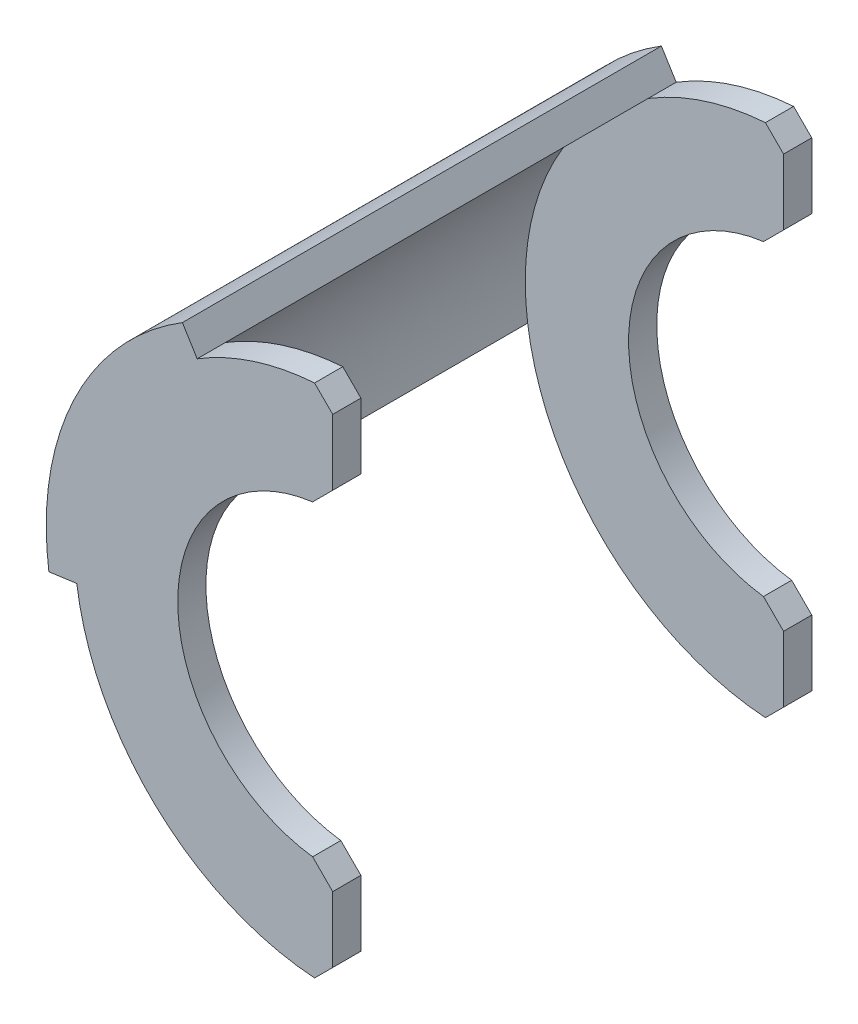
ISO-10303-21;
HEADER;
FILE_DESCRIPTION(('STEP AP214'),'2;1');
FILE_NAME('part.step','',(''),(''),'','','');
FILE_SCHEMA(('AUTOMOTIVE_DESIGN { 1 0 10303 214 1 1 1 1 }'));
ENDSEC;
DATA;
#1=APPLICATION_CONTEXT('core data for automotive mechanical design processes');
#2=APPLICATION_PROTOCOL_DEFINITION('international standard','automotive_design',2000,#1);
#3=PRODUCT_CONTEXT('',#1,'mechanical');
#4=PRODUCT('Part','Part','',(#3));
#5=PRODUCT_RELATED_PRODUCT_CATEGORY('part','',(#4));
#6=PRODUCT_DEFINITION_FORMATION('','',#4);
#7=PRODUCT_DEFINITION_CONTEXT('part definition',#1,'design');
#8=PRODUCT_DEFINITION('design','',#6,#7);
#9=PRODUCT_DEFINITION_SHAPE('','',#8);
#10=(LENGTH_UNIT() NAMED_UNIT(*) SI_UNIT(.MILLI.,.METRE.));
#11=(NAMED_UNIT(*) PLANE_ANGLE_UNIT() SI_UNIT($,.RADIAN.));
#12=(NAMED_UNIT(*) SI_UNIT($,.STERADIAN.) SOLID_ANGLE_UNIT());
#13=UNCERTAINTY_MEASURE_WITH_UNIT(LENGTH_MEASURE(1.E-05),#10,'distance_accuracy_value','');
#14=(GEOMETRIC_REPRESENTATION_CONTEXT(3) GLOBAL_UNCERTAINTY_ASSIGNED_CONTEXT((#13)) GLOBAL_UNIT_ASSIGNED_CONTEXT((#10,
#11,#12)) REPRESENTATION_CONTEXT('',''));
#15=CARTESIAN_POINT('',(0.,0.,0.));
#16=DIRECTION('',(0.,0.,1.));
#17=DIRECTION('',(1.,0.,0.));
#18=AXIS2_PLACEMENT_3D('',#15,#16,#17);
#19=CARTESIAN_POINT('',(0.,0.,-48.));
#20=DIRECTION('',(0.,0.,-1.));
#21=DIRECTION('',(-1.,0.,0.));
#22=AXIS2_PLACEMENT_3D('',#19,#20,#21);
#23=CYLINDRICAL_SURFACE('',#22,27.5);
#24=CARTESIAN_POINT('',(0.,0.,-51.));
#25=DIRECTION('',(0.,0.,-1.));
#26=DIRECTION('',(-1.,0.,0.));
#27=AXIS2_PLACEMENT_3D('',#24,#25,#26);
#28=CIRCLE('',#27,27.5);
#29=CARTESIAN_POINT('',(-1.93204686002601,-27.432046860026,-51.));
#30=VERTEX_POINT('',#29);
#31=CARTESIAN_POINT('',(-1.93204686002601,27.432046860026,-51.));
#32=VERTEX_POINT('',#31);
#33=EDGE_CURVE('E176',#30,#32,#28,.T.);
#34=ORIENTED_EDGE('',*,*,#33,.F.);
#35=DIRECTION('',(0.,0.,-1.));
#36=VECTOR('',#35,1.);
#37=CARTESIAN_POINT('',(-1.93204686002601,-27.432046860026,-48.));
#38=LINE('',#37,#36);
#39=CARTESIAN_POINT('',(-1.93204686002601,-27.432046860026,-48.));
#40=VERTEX_POINT('',#39);
#41=EDGE_CURVE('E156',#30,#40,#38,.F.);
#42=ORIENTED_EDGE('',*,*,#41,.T.);
#43=CARTESIAN_POINT('',(0.,0.,-48.));
#44=DIRECTION('',(0.,0.,-1.));
#45=DIRECTION('',(-1.,0.,0.));
#46=AXIS2_PLACEMENT_3D('',#43,#44,#45);
#47=CIRCLE('',#46,27.5);
#48=CARTESIAN_POINT('',(-1.93204686002601,27.432046860026,-48.));
#49=VERTEX_POINT('',#48);
#50=EDGE_CURVE('E137',#40,#49,#47,.T.);
#51=ORIENTED_EDGE('',*,*,#50,.T.);
#52=DIRECTION('',(0.,0.,-1.));
#53=VECTOR('',#52,1.);
#54=CARTESIAN_POINT('',(-1.93204686002601,27.432046860026,-48.));
#55=LINE('',#54,#53);
#56=EDGE_CURVE('E153',#49,#32,#55,.T.);
#57=ORIENTED_EDGE('',*,*,#56,.T.);
#58=EDGE_LOOP('',(#34,#42,#51,#57));
#59=FACE_BOUND('',#58,.T.);
#60=ADVANCED_FACE('F50',(#59),#23,.T.);
#61=CARTESIAN_POINT('',(0.,-16.5,-48.));
#62=DIRECTION('',(1.,0.,0.));
#63=DIRECTION('',(0.,1.,0.));
#64=AXIS2_PLACEMENT_3D('',#61,#62,#63);
#65=PLANE('',#64);
#66=DIRECTION('',(0.,-1.,0.));
#67=VECTOR('',#66,1.);
#68=CARTESIAN_POINT('',(0.,-16.5,-48.));
#69=LINE('',#68,#67);
#70=CARTESIAN_POINT('',(0.,-18.5,-48.));
#71=VERTEX_POINT('',#70);
#72=CARTESIAN_POINT('',(0.,-25.5,-48.));
#73=VERTEX_POINT('',#72);
#74=EDGE_CURVE('E142',#71,#73,#69,.T.);
#75=ORIENTED_EDGE('',*,*,#74,.T.);
#76=DIRECTION('',(0.,0.,-1.));
#77=VECTOR('',#76,1.);
#78=CARTESIAN_POINT('',(0.,-25.5,-48.));
#79=LINE('',#78,#77);
#80=CARTESIAN_POINT('',(0.,-25.5,-51.));
#81=VERTEX_POINT('',#80);
#82=EDGE_CURVE('E136',#73,#81,#79,.T.);
#83=ORIENTED_EDGE('',*,*,#82,.T.);
#84=DIRECTION('',(0.,-1.,0.));
#85=VECTOR('',#84,1.);
#86=CARTESIAN_POINT('',(0.,-16.5,-51.));
#87=LINE('',#86,#85);
#88=CARTESIAN_POINT('',(0.,-18.5,-51.));
#89=VERTEX_POINT('',#88);
#90=EDGE_CURVE('E119',#89,#81,#87,.T.);
#91=ORIENTED_EDGE('',*,*,#90,.F.);
#92=DIRECTION('',(0.,0.,1.));
#93=VECTOR('',#92,1.);
#94=CARTESIAN_POINT('',(0.,-18.5,-48.));
#95=LINE('',#94,#93);
#96=EDGE_CURVE('E133',#89,#71,#95,.T.);
#97=ORIENTED_EDGE('',*,*,#96,.T.);
#98=EDGE_LOOP('',(#75,#83,#91,#97));
#99=FACE_BOUND('',#98,.T.);
#100=ADVANCED_FACE('F132',(#99),#65,.T.);
#101=CARTESIAN_POINT('',(0.,0.,-48.));
#102=DIRECTION('',(0.,0.,-1.));
#103=DIRECTION('',(-1.,0.,0.));
#104=AXIS2_PLACEMENT_3D('',#101,#102,#103);
#105=CYLINDRICAL_SURFACE('',#104,16.5);
#106=CARTESIAN_POINT('',(0.,0.,-48.));
#107=DIRECTION('',(0.,0.,1.));
#108=DIRECTION('',(-1.,0.,0.));
#109=AXIS2_PLACEMENT_3D('',#106,#107,#108);
#110=CIRCLE('',#109,16.5);
#111=CARTESIAN_POINT('',(-2.13926867333605,16.3607313266639,-48.));
#112=VERTEX_POINT('',#111);
#113=CARTESIAN_POINT('',(-2.13926867333606,-16.3607313266639,-48.));
#114=VERTEX_POINT('',#113);
#115=EDGE_CURVE('E146',#112,#114,#110,.T.);
#116=ORIENTED_EDGE('',*,*,#115,.T.);
#117=DIRECTION('',(0.,0.,-1.));
#118=VECTOR('',#117,1.);
#119=CARTESIAN_POINT('',(-2.13926867333606,-16.3607313266639,-48.));
#120=LINE('',#119,#118);
#121=CARTESIAN_POINT('',(-2.13926867333606,-16.3607313266639,-51.));
#122=VERTEX_POINT('',#121);
#123=EDGE_CURVE('E166',#114,#122,#120,.T.);
#124=ORIENTED_EDGE('',*,*,#123,.T.);
#125=CARTESIAN_POINT('',(0.,0.,-51.));
#126=DIRECTION('',(0.,0.,1.));
#127=DIRECTION('',(-1.,0.,0.));
#128=AXIS2_PLACEMENT_3D('',#125,#126,#127);
#129=CIRCLE('',#128,16.5);
#130=CARTESIAN_POINT('',(-2.13926867333605,16.3607313266639,-51.));
#131=VERTEX_POINT('',#130);
#132=EDGE_CURVE('E121',#131,#122,#129,.T.);
#133=ORIENTED_EDGE('',*,*,#132,.F.);
#134=DIRECTION('',(0.,0.,-1.));
#135=VECTOR('',#134,1.);
#136=CARTESIAN_POINT('',(-2.13926867333605,16.3607313266639,-48.));
#137=LINE('',#136,#135);
#138=EDGE_CURVE('E164',#131,#112,#137,.F.);
#139=ORIENTED_EDGE('',*,*,#138,.T.);
#140=EDGE_LOOP('',(#116,#124,#133,#139));
#141=FACE_BOUND('',#140,.T.);
#142=ADVANCED_FACE('F169',(#141),#105,.F.);
#143=CARTESIAN_POINT('',(0.,27.5,-48.));
#144=DIRECTION('',(1.,0.,0.));
#145=DIRECTION('',(0.,1.,0.));
#146=AXIS2_PLACEMENT_3D('',#143,#144,#145);
#147=PLANE('',#146);
#148=DIRECTION('',(0.,-1.,0.));
#149=VECTOR('',#148,1.);
#150=CARTESIAN_POINT('',(0.,27.5,-48.));
#151=LINE('',#150,#149);
#152=CARTESIAN_POINT('',(0.,25.5,-48.));
#153=VERTEX_POINT('',#152);
#154=CARTESIAN_POINT('',(0.,18.5,-48.));
#155=VERTEX_POINT('',#154);
#156=EDGE_CURVE('E171',#153,#155,#151,.T.);
#157=ORIENTED_EDGE('',*,*,#156,.T.);
#158=DIRECTION('',(0.,0.,-1.));
#159=VECTOR('',#158,1.);
#160=CARTESIAN_POINT('',(0.,18.5,-48.));
#161=LINE('',#160,#159);
#162=CARTESIAN_POINT('',(0.,18.5,-51.));
#163=VERTEX_POINT('',#162);
#164=EDGE_CURVE('E12',#155,#163,#161,.T.);
#165=ORIENTED_EDGE('',*,*,#164,.T.);
#166=DIRECTION('',(0.,-1.,0.));
#167=VECTOR('',#166,1.);
#168=CARTESIAN_POINT('',(0.,27.5,-51.));
#169=LINE('',#168,#167);
#170=CARTESIAN_POINT('',(0.,25.5,-51.));
#171=VERTEX_POINT('',#170);
#172=EDGE_CURVE('E179',#171,#163,#169,.T.);
#173=ORIENTED_EDGE('',*,*,#172,.F.);
#174=DIRECTION('',(0.,0.,1.));
#175=VECTOR('',#174,1.);
#176=CARTESIAN_POINT('',(0.,25.5,-48.));
#177=LINE('',#176,#175);
#178=EDGE_CURVE('E58',#171,#153,#177,.T.);
#179=ORIENTED_EDGE('',*,*,#178,.T.);
#180=EDGE_LOOP('',(#157,#165,#173,#179));
#181=FACE_BOUND('',#180,.T.);
#182=ADVANCED_FACE('F181',(#181),#147,.T.);
#183=CARTESIAN_POINT('',(0.,0.,-48.));
#184=DIRECTION('',(0.,0.,-1.));
#185=DIRECTION('',(-1.,0.,0.));
#186=AXIS2_PLACEMENT_3D('',#183,#184,#185);
#187=PLANE('',#186);
#188=ORIENTED_EDGE('',*,*,#50,.F.);
#189=DIRECTION('',(-0.707106781186548,-0.707106781186547,0.));
#190=VECTOR('',#189,1.);
#191=CARTESIAN_POINT('',(0.,-25.5,-48.));
#192=LINE('',#191,#190);
#193=EDGE_CURVE('E162',#40,#73,#192,.F.);
#194=ORIENTED_EDGE('',*,*,#193,.T.);
#195=ORIENTED_EDGE('',*,*,#74,.F.);
#196=DIRECTION('',(0.707106781186548,-0.707106781186547,0.));
#197=VECTOR('',#196,1.);
#198=CARTESIAN_POINT('',(-2.13926867333606,-16.3607313266639,-48.));
#199=LINE('',#198,#197);
#200=EDGE_CURVE('E141',#71,#114,#199,.F.);
#201=ORIENTED_EDGE('',*,*,#200,.T.);
#202=ORIENTED_EDGE('',*,*,#115,.F.);
#203=DIRECTION('',(-0.707106781186548,-0.707106781186547,0.));
#204=VECTOR('',#203,1.);
#205=CARTESIAN_POINT('',(0.,18.5,-48.));
#206=LINE('',#205,#204);
#207=EDGE_CURVE('E65',#112,#155,#206,.F.);
#208=ORIENTED_EDGE('',*,*,#207,.T.);
#209=ORIENTED_EDGE('',*,*,#156,.F.);
#210=DIRECTION('',(0.707106781186546,-0.707106781186549,0.));
#211=VECTOR('',#210,1.);
#212=CARTESIAN_POINT('',(-1.93204686002601,27.432046860026,-48.));
#213=LINE('',#212,#211);
#214=EDGE_CURVE('E158',#153,#49,#213,.F.);
#215=ORIENTED_EDGE('',*,*,#214,.T.);
#216=EDGE_LOOP('',(#188,#194,#195,#201,#202,#208,#209,#215));
#217=FACE_BOUND('',#216,.T.);
#218=ADVANCED_FACE('F188',(#217),#187,.F.);
#219=CARTESIAN_POINT('',(0.,0.,-51.));
#220=DIRECTION('',(0.,0.,-1.));
#221=DIRECTION('',(-1.,0.,0.));
#222=AXIS2_PLACEMENT_3D('',#219,#220,#221);
#223=PLANE('',#222);
#224=ORIENTED_EDGE('',*,*,#90,.T.);
#225=DIRECTION('',(0.707106781186548,0.707106781186547,0.));
#226=VECTOR('',#225,1.);
#227=CARTESIAN_POINT('',(12.75,-12.75,-51.));
#228=LINE('',#227,#226);
#229=EDGE_CURVE('E126',#81,#30,#228,.F.);
#230=ORIENTED_EDGE('',*,*,#229,.T.);
#231=ORIENTED_EDGE('',*,*,#33,.T.);
#232=DIRECTION('',(-0.707106781186546,0.707106781186549,0.));
#233=VECTOR('',#232,1.);
#234=CARTESIAN_POINT('',(12.75,12.75,-51.));
#235=LINE('',#234,#233);
#236=EDGE_CURVE('E144',#32,#171,#235,.F.);
#237=ORIENTED_EDGE('',*,*,#236,.T.);
#238=ORIENTED_EDGE('',*,*,#172,.T.);
#239=DIRECTION('',(0.707106781186548,0.707106781186547,0.));
#240=VECTOR('',#239,1.);
#241=CARTESIAN_POINT('',(-9.25,9.25000000000001,-51.));
#242=LINE('',#241,#240);
#243=EDGE_CURVE('E127',#163,#131,#242,.F.);
#244=ORIENTED_EDGE('',*,*,#243,.T.);
#245=ORIENTED_EDGE('',*,*,#132,.T.);
#246=DIRECTION('',(-0.707106781186548,0.707106781186547,0.));
#247=VECTOR('',#246,1.);
#248=CARTESIAN_POINT('',(-9.25,-9.25,-51.));
#249=LINE('',#248,#247);
#250=EDGE_CURVE('E116',#122,#89,#249,.F.);
#251=ORIENTED_EDGE('',*,*,#250,.T.);
#252=EDGE_LOOP('',(#224,#230,#231,#237,#238,#244,#245,#251));
#253=FACE_BOUND('',#252,.T.);
#254=ADVANCED_FACE('F118',(#253),#223,.T.);
#255=CARTESIAN_POINT('',(0.,-25.5,-48.));
#256=DIRECTION('',(-0.707106781186547,0.707106781186548,0.));
#257=DIRECTION('',(0.,0.,-1.));
#258=AXIS2_PLACEMENT_3D('',#255,#256,#257);
#259=PLANE('',#258);
#260=ORIENTED_EDGE('',*,*,#193,.F.);
#261=ORIENTED_EDGE('',*,*,#41,.F.);
#262=ORIENTED_EDGE('',*,*,#229,.F.);
#263=ORIENTED_EDGE('',*,*,#82,.F.);
#264=EDGE_LOOP('',(#260,#261,#262,#263));
#265=FACE_BOUND('',#264,.T.);
#266=ADVANCED_FACE('F194',(#265),#259,.F.);
#267=CARTESIAN_POINT('',(-2.13926867333606,-16.3607313266639,-48.));
#268=DIRECTION('',(-0.707106781186547,-0.707106781186548,0.));
#269=DIRECTION('',(0.,0.,-1.));
#270=AXIS2_PLACEMENT_3D('',#267,#268,#269);
#271=PLANE('',#270);
#272=ORIENTED_EDGE('',*,*,#200,.F.);
#273=ORIENTED_EDGE('',*,*,#96,.F.);
#274=ORIENTED_EDGE('',*,*,#250,.F.);
#275=ORIENTED_EDGE('',*,*,#123,.F.);
#276=EDGE_LOOP('',(#272,#273,#274,#275));
#277=FACE_BOUND('',#276,.T.);
#278=ADVANCED_FACE('F140',(#277),#271,.F.);
#279=CARTESIAN_POINT('',(0.,18.5,-48.));
#280=DIRECTION('',(-0.707106781186547,0.707106781186548,0.));
#281=DIRECTION('',(0.,0.,-1.));
#282=AXIS2_PLACEMENT_3D('',#279,#280,#281);
#283=PLANE('',#282);
#284=ORIENTED_EDGE('',*,*,#207,.F.);
#285=ORIENTED_EDGE('',*,*,#138,.F.);
#286=ORIENTED_EDGE('',*,*,#243,.F.);
#287=ORIENTED_EDGE('',*,*,#164,.F.);
#288=EDGE_LOOP('',(#284,#285,#286,#287));
#289=FACE_BOUND('',#288,.T.);
#290=ADVANCED_FACE('F201',(#289),#283,.F.);
#291=CARTESIAN_POINT('',(-1.93204686002601,27.432046860026,-48.));
#292=DIRECTION('',(-0.707106781186549,-0.707106781186546,0.));
#293=DIRECTION('',(0.,0.,-1.));
#294=AXIS2_PLACEMENT_3D('',#291,#292,#293);
#295=PLANE('',#294);
#296=ORIENTED_EDGE('',*,*,#214,.F.);
#297=ORIENTED_EDGE('',*,*,#178,.F.);
#298=ORIENTED_EDGE('',*,*,#236,.F.);
#299=ORIENTED_EDGE('',*,*,#56,.F.);
#300=EDGE_LOOP('',(#296,#297,#298,#299));
#301=FACE_BOUND('',#300,.T.);
#302=ADVANCED_FACE('F52',(#301),#295,.F.);
#303=CLOSED_SHELL('',(#60,#100,#142,#182,#218,#254,#266,#278,#290,#302));
#304=MANIFOLD_SOLID_BREP('B2',#303);
#305=CARTESIAN_POINT('',(0.,0.,-3.));
#306=DIRECTION('',(0.,0.,1.));
#307=DIRECTION('',(1.,0.,0.));
#308=AXIS2_PLACEMENT_3D('',#305,#306,#307);
#309=CYLINDRICAL_SURFACE('',#308,27.5);
#310=CARTESIAN_POINT('',(0.,0.,-3.));
#311=DIRECTION('',(0.,0.,1.));
#312=DIRECTION('',(1.,0.,0.));
#313=AXIS2_PLACEMENT_3D('',#310,#311,#312);
#314=CIRCLE('',#313,27.5);
#315=CARTESIAN_POINT('',(-27.2478596751051,-3.71539272833709,-3.));
#316=VERTEX_POINT('',#315);
#317=CARTESIAN_POINT('',(-1.93204686002601,-27.432046860026,-3.));
#318=VERTEX_POINT('',#317);
#319=EDGE_CURVE('E415',#316,#318,#314,.T.);
#320=ORIENTED_EDGE('',*,*,#319,.T.);
#321=DIRECTION('',(0.,0.,1.));
#322=VECTOR('',#321,1.);
#323=CARTESIAN_POINT('',(-1.93204686002601,-27.432046860026,-3.));
#324=LINE('',#323,#322);
#325=CARTESIAN_POINT('',(-1.93204686002601,-27.432046860026,0.));
#326=VERTEX_POINT('',#325);
#327=EDGE_CURVE('E423',#318,#326,#324,.T.);
#328=ORIENTED_EDGE('',*,*,#327,.T.);
#329=CARTESIAN_POINT('',(0.,0.,0.));
#330=DIRECTION('',(0.,0.,1.));
#331=DIRECTION('',(1.,0.,0.));
#332=AXIS2_PLACEMENT_3D('',#329,#330,#331);
#333=CIRCLE('',#332,27.5);
#334=CARTESIAN_POINT('',(-27.2478596751051,-3.71539272833709,0.));
#335=VERTEX_POINT('',#334);
#336=EDGE_CURVE('E411',#335,#326,#333,.T.);
#337=ORIENTED_EDGE('',*,*,#336,.F.);
#338=DIRECTION('',(0.,0.,1.));
#339=VECTOR('',#338,1.);
#340=CARTESIAN_POINT('',(-27.2478596751051,-3.71539272833709,-51.));
#341=LINE('',#340,#339);
#342=EDGE_CURVE('E406',#316,#335,#341,.T.);
#343=ORIENTED_EDGE('',*,*,#342,.F.);
#344=EDGE_LOOP('',(#320,#328,#337,#343));
#345=FACE_BOUND('',#344,.T.);
#346=ADVANCED_FACE('F269',(#345),#309,.T.);
#347=CARTESIAN_POINT('',(-1.93204686002601,27.432046860026,0.));
#348=VERTEX_POINT('',#347);
#349=CARTESIAN_POINT('',(-14.431370787625,23.4090909090909,0.));
#350=VERTEX_POINT('',#349);
#351=EDGE_CURVE('E424',#348,#350,#333,.T.);
#352=ORIENTED_EDGE('',*,*,#351,.F.);
#353=DIRECTION('',(0.,0.,1.));
#354=VECTOR('',#353,1.);
#355=CARTESIAN_POINT('',(-1.93204686002601,27.432046860026,-3.));
#356=LINE('',#355,#354);
#357=CARTESIAN_POINT('',(-1.93204686002601,27.432046860026,-3.));
#358=VERTEX_POINT('',#357);
#359=EDGE_CURVE('E48',#348,#358,#356,.F.);
#360=ORIENTED_EDGE('',*,*,#359,.T.);
#361=CARTESIAN_POINT('',(-14.431370787625,23.4090909090909,-3.));
#362=VERTEX_POINT('',#361);
#363=EDGE_CURVE('E412',#358,#362,#314,.T.);
#364=ORIENTED_EDGE('',*,*,#363,.T.);
#365=DIRECTION('',(0.,0.,1.));
#366=VECTOR('',#365,1.);
#367=CARTESIAN_POINT('',(-14.431370787625,23.4090909090909,-51.));
#368=LINE('',#367,#366);
#369=EDGE_CURVE('E372',#362,#350,#368,.T.);
#370=ORIENTED_EDGE('',*,*,#369,.T.);
#371=EDGE_LOOP('',(#352,#360,#364,#370));
#372=FACE_BOUND('',#371,.T.);
#373=ADVANCED_FACE('F505',(#372),#309,.T.);
#374=CARTESIAN_POINT('',(0.,27.5,-3.));
#375=DIRECTION('',(1.,0.,0.));
#376=DIRECTION('',(0.,1.,0.));
#377=AXIS2_PLACEMENT_3D('',#374,#375,#376);
#378=PLANE('',#377);
#379=DIRECTION('',(0.,1.,0.));
#380=VECTOR('',#379,1.);
#381=CARTESIAN_POINT('',(0.,27.5,0.));
#382=LINE('',#381,#380);
#383=CARTESIAN_POINT('',(0.,18.5,0.));
#384=VERTEX_POINT('',#383);
#385=CARTESIAN_POINT('',(0.,25.5,0.));
#386=VERTEX_POINT('',#385);
#387=EDGE_CURVE('E432',#384,#386,#382,.T.);
#388=ORIENTED_EDGE('',*,*,#387,.F.);
#389=DIRECTION('',(0.,0.,-1.));
#390=VECTOR('',#389,1.);
#391=CARTESIAN_POINT('',(0.,18.5,-3.));
#392=LINE('',#391,#390);
#393=CARTESIAN_POINT('',(0.,18.5,-3.));
#394=VERTEX_POINT('',#393);
#395=EDGE_CURVE('E277',#384,#394,#392,.T.);
#396=ORIENTED_EDGE('',*,*,#395,.T.);
#397=DIRECTION('',(0.,1.,0.));
#398=VECTOR('',#397,1.);
#399=CARTESIAN_POINT('',(0.,27.5,-3.));
#400=LINE('',#399,#398);
#401=CARTESIAN_POINT('',(0.,25.5,-3.));
#402=VERTEX_POINT('',#401);
#403=EDGE_CURVE('E420',#394,#402,#400,.T.);
#404=ORIENTED_EDGE('',*,*,#403,.T.);
#405=DIRECTION('',(0.,0.,1.));
#406=VECTOR('',#405,1.);
#407=CARTESIAN_POINT('',(0.,25.5,-3.));
#408=LINE('',#407,#406);
#409=EDGE_CURVE('E461',#402,#386,#408,.T.);
#410=ORIENTED_EDGE('',*,*,#409,.T.);
#411=EDGE_LOOP('',(#388,#396,#404,#410));
#412=FACE_BOUND('',#411,.T.);
#413=ADVANCED_FACE('F466',(#412),#378,.T.);
#414=CARTESIAN_POINT('',(0.,0.,-3.));
#415=DIRECTION('',(0.,0.,1.));
#416=DIRECTION('',(1.,0.,0.));
#417=AXIS2_PLACEMENT_3D('',#414,#415,#416);
#418=CYLINDRICAL_SURFACE('',#417,16.5);
#419=CARTESIAN_POINT('',(0.,0.,0.));
#420=DIRECTION('',(0.,0.,-1.));
#421=DIRECTION('',(1.,0.,0.));
#422=AXIS2_PLACEMENT_3D('',#419,#420,#421);
#423=CIRCLE('',#422,16.5);
#424=CARTESIAN_POINT('',(-2.13926867333607,-16.3607313266639,0.));
#425=VERTEX_POINT('',#424);
#426=CARTESIAN_POINT('',(-2.13926867333605,16.3607313266639,0.));
#427=VERTEX_POINT('',#426);
#428=EDGE_CURVE('E429',#425,#427,#423,.T.);
#429=ORIENTED_EDGE('',*,*,#428,.F.);
#430=DIRECTION('',(0.,0.,1.));
#431=VECTOR('',#430,1.);
#432=CARTESIAN_POINT('',(-2.13926867333607,-16.3607313266639,-3.));
#433=LINE('',#432,#431);
#434=CARTESIAN_POINT('',(-2.13926867333607,-16.3607313266639,-3.));
#435=VERTEX_POINT('',#434);
#436=EDGE_CURVE('E291',#425,#435,#433,.F.);
#437=ORIENTED_EDGE('',*,*,#436,.T.);
#438=CARTESIAN_POINT('',(0.,0.,-3.));
#439=DIRECTION('',(0.,0.,-1.));
#440=DIRECTION('',(1.,0.,0.));
#441=AXIS2_PLACEMENT_3D('',#438,#439,#440);
#442=CIRCLE('',#441,16.5);
#443=CARTESIAN_POINT('',(-2.13926867333605,16.3607313266639,-3.));
#444=VERTEX_POINT('',#443);
#445=EDGE_CURVE('E418',#435,#444,#442,.T.);
#446=ORIENTED_EDGE('',*,*,#445,.T.);
#447=DIRECTION('',(0.,0.,1.));
#448=VECTOR('',#447,1.);
#449=CARTESIAN_POINT('',(-2.13926867333605,16.3607313266639,-3.));
#450=LINE('',#449,#448);
#451=EDGE_CURVE('E457',#444,#427,#450,.T.);
#452=ORIENTED_EDGE('',*,*,#451,.T.);
#453=EDGE_LOOP('',(#429,#437,#446,#452));
#454=FACE_BOUND('',#453,.T.);
#455=ADVANCED_FACE('F475',(#454),#418,.F.);
#456=CARTESIAN_POINT('',(0.,-16.5,-3.));
#457=DIRECTION('',(1.,0.,0.));
#458=DIRECTION('',(0.,1.,0.));
#459=AXIS2_PLACEMENT_3D('',#456,#457,#458);
#460=PLANE('',#459);
#461=DIRECTION('',(0.,1.,0.));
#462=VECTOR('',#461,1.);
#463=CARTESIAN_POINT('',(0.,-16.5,0.));
#464=LINE('',#463,#462);
#465=CARTESIAN_POINT('',(0.,-25.5,0.));
#466=VERTEX_POINT('',#465);
#467=CARTESIAN_POINT('',(0.,-18.5,0.));
#468=VERTEX_POINT('',#467);
#469=EDGE_CURVE('E426',#466,#468,#464,.T.);
#470=ORIENTED_EDGE('',*,*,#469,.F.);
#471=DIRECTION('',(0.,0.,-1.));
#472=VECTOR('',#471,1.);
#473=CARTESIAN_POINT('',(0.,-25.5,-3.));
#474=LINE('',#473,#472);
#475=CARTESIAN_POINT('',(0.,-25.5,-3.));
#476=VERTEX_POINT('',#475);
#477=EDGE_CURVE('E448',#466,#476,#474,.T.);
#478=ORIENTED_EDGE('',*,*,#477,.T.);
#479=DIRECTION('',(0.,1.,0.));
#480=VECTOR('',#479,1.);
#481=CARTESIAN_POINT('',(0.,-16.5,-3.));
#482=LINE('',#481,#480);
#483=CARTESIAN_POINT('',(0.,-18.5,-3.));
#484=VERTEX_POINT('',#483);
#485=EDGE_CURVE('E414',#476,#484,#482,.T.);
#486=ORIENTED_EDGE('',*,*,#485,.T.);
#487=DIRECTION('',(0.,0.,1.));
#488=VECTOR('',#487,1.);
#489=CARTESIAN_POINT('',(0.,-18.5,-3.));
#490=LINE('',#489,#488);
#491=EDGE_CURVE('E445',#484,#468,#490,.T.);
#492=ORIENTED_EDGE('',*,*,#491,.T.);
#493=EDGE_LOOP('',(#470,#478,#486,#492));
#494=FACE_BOUND('',#493,.T.);
#495=ADVANCED_FACE('F485',(#494),#460,.T.);
#496=CARTESIAN_POINT('',(0.,0.,-3.));
#497=DIRECTION('',(0.,0.,1.));
#498=DIRECTION('',(1.,0.,0.));
#499=AXIS2_PLACEMENT_3D('',#496,#497,#498);
#500=PLANE('',#499);
#501=ORIENTED_EDGE('',*,*,#485,.F.);
#502=DIRECTION('',(0.707106781186546,0.707106781186549,0.));
#503=VECTOR('',#502,1.);
#504=CARTESIAN_POINT('',(-1.93204686002601,-27.432046860026,-3.));
#505=LINE('',#504,#503);
#506=EDGE_CURVE('E455',#476,#318,#505,.F.);
#507=ORIENTED_EDGE('',*,*,#506,.T.);
#508=ORIENTED_EDGE('',*,*,#319,.F.);
#509=CARTESIAN_POINT('',(0.,0.,-3.));
#510=DIRECTION('',(0.,0.,1.));
#511=DIRECTION('',(1.,0.,0.));
#512=AXIS2_PLACEMENT_3D('',#509,#510,#511);
#513=CIRCLE('',#512,27.5);
#514=EDGE_CURVE('E405',#316,#362,#513,.F.);
#515=ORIENTED_EDGE('',*,*,#514,.T.);
#516=ORIENTED_EDGE('',*,*,#363,.F.);
#517=DIRECTION('',(-0.707106781186547,0.707106781186548,0.));
#518=VECTOR('',#517,1.);
#519=CARTESIAN_POINT('',(0.,25.5,-3.));
#520=LINE('',#519,#518);
#521=EDGE_CURVE('E450',#358,#402,#520,.F.);
#522=ORIENTED_EDGE('',*,*,#521,.T.);
#523=ORIENTED_EDGE('',*,*,#403,.F.);
#524=DIRECTION('',(0.707106781186548,0.707106781186547,0.));
#525=VECTOR('',#524,1.);
#526=CARTESIAN_POINT('',(-2.13926867333604,16.3607313266639,-3.));
#527=LINE('',#526,#525);
#528=EDGE_CURVE('E284',#394,#444,#527,.F.);
#529=ORIENTED_EDGE('',*,*,#528,.T.);
#530=ORIENTED_EDGE('',*,*,#445,.F.);
#531=DIRECTION('',(-0.707106781186547,0.707106781186548,0.));
#532=VECTOR('',#531,1.);
#533=CARTESIAN_POINT('',(0.,-18.5,-3.));
#534=LINE('',#533,#532);
#535=EDGE_CURVE('E453',#435,#484,#534,.F.);
#536=ORIENTED_EDGE('',*,*,#535,.T.);
#537=EDGE_LOOP('',(#501,#507,#508,#515,#516,#522,#523,#529,#530,#536));
#538=FACE_BOUND('',#537,.T.);
#539=ADVANCED_FACE('F470',(#538),#500,.F.);
#540=CARTESIAN_POINT('',(0.,0.,0.));
#541=DIRECTION('',(0.,0.,1.));
#542=DIRECTION('',(1.,0.,0.));
#543=AXIS2_PLACEMENT_3D('',#540,#541,#542);
#544=PLANE('',#543);
#545=ORIENTED_EDGE('',*,*,#336,.T.);
#546=DIRECTION('',(-0.707106781186546,-0.707106781186549,0.));
#547=VECTOR('',#546,1.);
#548=CARTESIAN_POINT('',(12.75,-12.7499999999999,0.));
#549=LINE('',#548,#547);
#550=EDGE_CURVE('E443',#326,#466,#549,.F.);
#551=ORIENTED_EDGE('',*,*,#550,.T.);
#552=ORIENTED_EDGE('',*,*,#469,.T.);
#553=DIRECTION('',(0.707106781186547,-0.707106781186548,0.));
#554=VECTOR('',#553,1.);
#555=CARTESIAN_POINT('',(-9.25000000000001,-9.25,0.));
#556=LINE('',#555,#554);
#557=EDGE_CURVE('E441',#468,#425,#556,.F.);
#558=ORIENTED_EDGE('',*,*,#557,.T.);
#559=ORIENTED_EDGE('',*,*,#428,.T.);
#560=DIRECTION('',(-0.707106781186548,-0.707106781186547,0.));
#561=VECTOR('',#560,1.);
#562=CARTESIAN_POINT('',(-9.24999999999999,9.25,0.));
#563=LINE('',#562,#561);
#564=EDGE_CURVE('E439',#427,#384,#563,.F.);
#565=ORIENTED_EDGE('',*,*,#564,.T.);
#566=ORIENTED_EDGE('',*,*,#387,.T.);
#567=DIRECTION('',(0.707106781186547,-0.707106781186548,0.));
#568=VECTOR('',#567,1.);
#569=CARTESIAN_POINT('',(12.75,12.75,0.));
#570=LINE('',#569,#568);
#571=EDGE_CURVE('E437',#386,#348,#570,.F.);
#572=ORIENTED_EDGE('',*,*,#571,.T.);
#573=ORIENTED_EDGE('',*,*,#351,.T.);
#574=DIRECTION('',(-0.524777119550002,0.851239669421488,0.));
#575=VECTOR('',#574,1.);
#576=CARTESIAN_POINT('',(-14.431370787625,23.4090909090909,0.));
#577=LINE('',#576,#575);
#578=CARTESIAN_POINT('',(-16.005702146275,25.9628099173554,0.));
#579=VERTEX_POINT('',#578);
#580=EDGE_CURVE('E399',#350,#579,#577,.T.);
#581=ORIENTED_EDGE('',*,*,#580,.T.);
#582=CARTESIAN_POINT('',(0.,0.,0.));
#583=DIRECTION('',(0.,0.,1.));
#584=DIRECTION('',(1.,0.,0.));
#585=AXIS2_PLACEMENT_3D('',#582,#583,#584);
#586=CIRCLE('',#585,30.5);
#587=CARTESIAN_POINT('',(-30.2203534578439,-4.12070829870114,0.));
#588=VERTEX_POINT('',#587);
#589=EDGE_CURVE('E393',#579,#588,#586,.T.);
#590=ORIENTED_EDGE('',*,*,#589,.T.);
#591=DIRECTION('',(0.990831260912914,0.135105190121349,0.));
#592=VECTOR('',#591,1.);
#593=CARTESIAN_POINT('',(-27.2478596751051,-3.71539272833709,0.));
#594=LINE('',#593,#592);
#595=EDGE_CURVE('E391',#588,#335,#594,.T.);
#596=ORIENTED_EDGE('',*,*,#595,.T.);
#597=EDGE_LOOP('',(#545,#551,#552,#558,#559,#565,#566,#572,#573,#581,#590,#596));
#598=FACE_BOUND('',#597,.T.);
#599=ADVANCED_FACE('F478',(#598),#544,.T.);
#600=CARTESIAN_POINT('',(0.,0.,-51.));
#601=DIRECTION('',(0.,0.,1.));
#602=DIRECTION('',(1.,0.,0.));
#603=AXIS2_PLACEMENT_3D('',#600,#601,#602);
#604=CYLINDRICAL_SURFACE('',#603,27.5);
#605=ORIENTED_EDGE('',*,*,#514,.F.);
#606=CARTESIAN_POINT('',(-27.2478596751051,-3.71539272833709,-51.));
#607=VERTEX_POINT('',#606);
#608=EDGE_CURVE('E390',#607,#316,#341,.T.);
#609=ORIENTED_EDGE('',*,*,#608,.F.);
#610=CARTESIAN_POINT('',(0.,0.,-51.));
#611=DIRECTION('',(0.,0.,-1.));
#612=DIRECTION('',(1.,0.,0.));
#613=AXIS2_PLACEMENT_3D('',#610,#611,#612);
#614=CIRCLE('',#613,27.5);
#615=CARTESIAN_POINT('',(-14.431370787625,23.4090909090909,-51.));
#616=VERTEX_POINT('',#615);
#617=EDGE_CURVE('E383',#607,#616,#614,.T.);
#618=ORIENTED_EDGE('',*,*,#617,.T.);
#619=EDGE_CURVE('E366',#616,#362,#368,.T.);
#620=ORIENTED_EDGE('',*,*,#619,.T.);
#621=EDGE_LOOP('',(#605,#609,#618,#620));
#622=FACE_BOUND('',#621,.T.);
#623=ADVANCED_FACE('F388',(#622),#604,.F.);
#624=CARTESIAN_POINT('',(-27.2478596751051,-3.71539272833709,-51.));
#625=DIRECTION('',(0.135105190121349,-0.990831260912914,0.));
#626=DIRECTION('',(0.990831260912914,0.135105190121349,0.));
#627=AXIS2_PLACEMENT_3D('',#624,#625,#626);
#628=PLANE('',#627);
#629=ORIENTED_EDGE('',*,*,#595,.F.);
#630=DIRECTION('',(0.,0.,1.));
#631=VECTOR('',#630,1.);
#632=CARTESIAN_POINT('',(-30.2203534578439,-4.12070829870114,-51.));
#633=LINE('',#632,#631);
#634=CARTESIAN_POINT('',(-30.2203534578439,-4.12070829870114,-51.));
#635=VERTEX_POINT('',#634);
#636=EDGE_CURVE('E407',#635,#588,#633,.T.);
#637=ORIENTED_EDGE('',*,*,#636,.F.);
#638=DIRECTION('',(0.990831260912914,0.135105190121349,0.));
#639=VECTOR('',#638,1.);
#640=CARTESIAN_POINT('',(-27.2478596751051,-3.71539272833709,-51.));
#641=LINE('',#640,#639);
#642=EDGE_CURVE('E397',#635,#607,#641,.T.);
#643=ORIENTED_EDGE('',*,*,#642,.T.);
#644=ORIENTED_EDGE('',*,*,#608,.T.);
#645=ORIENTED_EDGE('',*,*,#342,.T.);
#646=EDGE_LOOP('',(#629,#637,#643,#644,#645));
#647=FACE_BOUND('',#646,.T.);
#648=ADVANCED_FACE('F500',(#647),#628,.T.);
#649=CARTESIAN_POINT('',(0.,0.,-51.));
#650=DIRECTION('',(0.,0.,1.));
#651=DIRECTION('',(1.,0.,0.));
#652=AXIS2_PLACEMENT_3D('',#649,#650,#651);
#653=CYLINDRICAL_SURFACE('',#652,30.5);
#654=ORIENTED_EDGE('',*,*,#589,.F.);
#655=DIRECTION('',(0.,0.,1.));
#656=VECTOR('',#655,1.);
#657=CARTESIAN_POINT('',(-16.005702146275,25.9628099173554,-51.));
#658=LINE('',#657,#656);
#659=CARTESIAN_POINT('',(-16.005702146275,25.9628099173554,-51.));
#660=VERTEX_POINT('',#659);
#661=EDGE_CURVE('E376',#660,#579,#658,.T.);
#662=ORIENTED_EDGE('',*,*,#661,.F.);
#663=CARTESIAN_POINT('',(0.,0.,-51.));
#664=DIRECTION('',(0.,0.,1.));
#665=DIRECTION('',(1.,0.,0.));
#666=AXIS2_PLACEMENT_3D('',#663,#664,#665);
#667=CIRCLE('',#666,30.5);
#668=EDGE_CURVE('E386',#660,#635,#667,.T.);
#669=ORIENTED_EDGE('',*,*,#668,.T.);
#670=ORIENTED_EDGE('',*,*,#636,.T.);
#671=EDGE_LOOP('',(#654,#662,#669,#670));
#672=FACE_BOUND('',#671,.T.);
#673=ADVANCED_FACE('F548',(#672),#653,.T.);
#674=CARTESIAN_POINT('',(-14.431370787625,23.4090909090909,-51.));
#675=DIRECTION('',(0.851239669421488,0.524777119550002,0.));
#676=DIRECTION('',(-0.524777119550002,0.851239669421487,0.));
#677=AXIS2_PLACEMENT_3D('',#674,#675,#676);
#678=PLANE('',#677);
#679=ORIENTED_EDGE('',*,*,#580,.F.);
#680=ORIENTED_EDGE('',*,*,#369,.F.);
#681=ORIENTED_EDGE('',*,*,#619,.F.);
#682=DIRECTION('',(-0.524777119550002,0.851239669421488,0.));
#683=VECTOR('',#682,1.);
#684=CARTESIAN_POINT('',(-14.431370787625,23.4090909090909,-51.));
#685=LINE('',#684,#683);
#686=EDGE_CURVE('E370',#616,#660,#685,.T.);
#687=ORIENTED_EDGE('',*,*,#686,.T.);
#688=ORIENTED_EDGE('',*,*,#661,.T.);
#689=EDGE_LOOP('',(#679,#680,#681,#687,#688));
#690=FACE_BOUND('',#689,.T.);
#691=ADVANCED_FACE('F369',(#690),#678,.T.);
#692=CARTESIAN_POINT('',(0.,0.,-51.));
#693=DIRECTION('',(0.,0.,1.));
#694=DIRECTION('',(1.,0.,0.));
#695=AXIS2_PLACEMENT_3D('',#692,#693,#694);
#696=PLANE('',#695);
#697=ORIENTED_EDGE('',*,*,#617,.F.);
#698=ORIENTED_EDGE('',*,*,#642,.F.);
#699=ORIENTED_EDGE('',*,*,#668,.F.);
#700=ORIENTED_EDGE('',*,*,#686,.F.);
#701=EDGE_LOOP('',(#697,#698,#699,#700));
#702=FACE_BOUND('',#701,.T.);
#703=ADVANCED_FACE('F381',(#702),#696,.F.);
#704=CARTESIAN_POINT('',(-1.93204686002601,-27.432046860026,-3.));
#705=DIRECTION('',(-0.707106781186549,0.707106781186546,0.));
#706=DIRECTION('',(0.,0.,1.));
#707=AXIS2_PLACEMENT_3D('',#704,#705,#706);
#708=PLANE('',#707);
#709=ORIENTED_EDGE('',*,*,#506,.F.);
#710=ORIENTED_EDGE('',*,*,#477,.F.);
#711=ORIENTED_EDGE('',*,*,#550,.F.);
#712=ORIENTED_EDGE('',*,*,#327,.F.);
#713=EDGE_LOOP('',(#709,#710,#711,#712));
#714=FACE_BOUND('',#713,.T.);
#715=ADVANCED_FACE('F492',(#714),#708,.F.);
#716=CARTESIAN_POINT('',(0.,-18.5,-3.));
#717=DIRECTION('',(-0.707106781186548,-0.707106781186547,0.));
#718=DIRECTION('',(0.,0.,1.));
#719=AXIS2_PLACEMENT_3D('',#716,#717,#718);
#720=PLANE('',#719);
#721=ORIENTED_EDGE('',*,*,#535,.F.);
#722=ORIENTED_EDGE('',*,*,#436,.F.);
#723=ORIENTED_EDGE('',*,*,#557,.F.);
#724=ORIENTED_EDGE('',*,*,#491,.F.);
#725=EDGE_LOOP('',(#721,#722,#723,#724));
#726=FACE_BOUND('',#725,.T.);
#727=ADVANCED_FACE('F483',(#726),#720,.F.);
#728=CARTESIAN_POINT('',(-2.13926867333604,16.3607313266639,-3.));
#729=DIRECTION('',(-0.707106781186547,0.707106781186548,0.));
#730=DIRECTION('',(0.,0.,1.));
#731=AXIS2_PLACEMENT_3D('',#728,#729,#730);
#732=PLANE('',#731);
#733=ORIENTED_EDGE('',*,*,#528,.F.);
#734=ORIENTED_EDGE('',*,*,#395,.F.);
#735=ORIENTED_EDGE('',*,*,#564,.F.);
#736=ORIENTED_EDGE('',*,*,#451,.F.);
#737=EDGE_LOOP('',(#733,#734,#735,#736));
#738=FACE_BOUND('',#737,.T.);
#739=ADVANCED_FACE('F474',(#738),#732,.F.);
#740=CARTESIAN_POINT('',(0.,25.5,-3.));
#741=DIRECTION('',(-0.707106781186548,-0.707106781186547,0.));
#742=DIRECTION('',(0.,0.,1.));
#743=AXIS2_PLACEMENT_3D('',#740,#741,#742);
#744=PLANE('',#743);
#745=ORIENTED_EDGE('',*,*,#521,.F.);
#746=ORIENTED_EDGE('',*,*,#359,.F.);
#747=ORIENTED_EDGE('',*,*,#571,.F.);
#748=ORIENTED_EDGE('',*,*,#409,.F.);
#749=EDGE_LOOP('',(#745,#746,#747,#748));
#750=FACE_BOUND('',#749,.T.);
#751=ADVANCED_FACE('F271',(#750),#744,.F.);
#752=CLOSED_SHELL('',(#346,#373,#413,#455,#495,#539,#599,#623,#648,#673,#691,#703,#715,#727,
#739,#751));
#753=MANIFOLD_SOLID_BREP('B6',#752);
#754=ADVANCED_BREP_SHAPE_REPRESENTATION('',(#18,#304,#753),#14);
#755=SHAPE_DEFINITION_REPRESENTATION(#9,#754);
ENDSEC;
END-ISO-10303-21;
